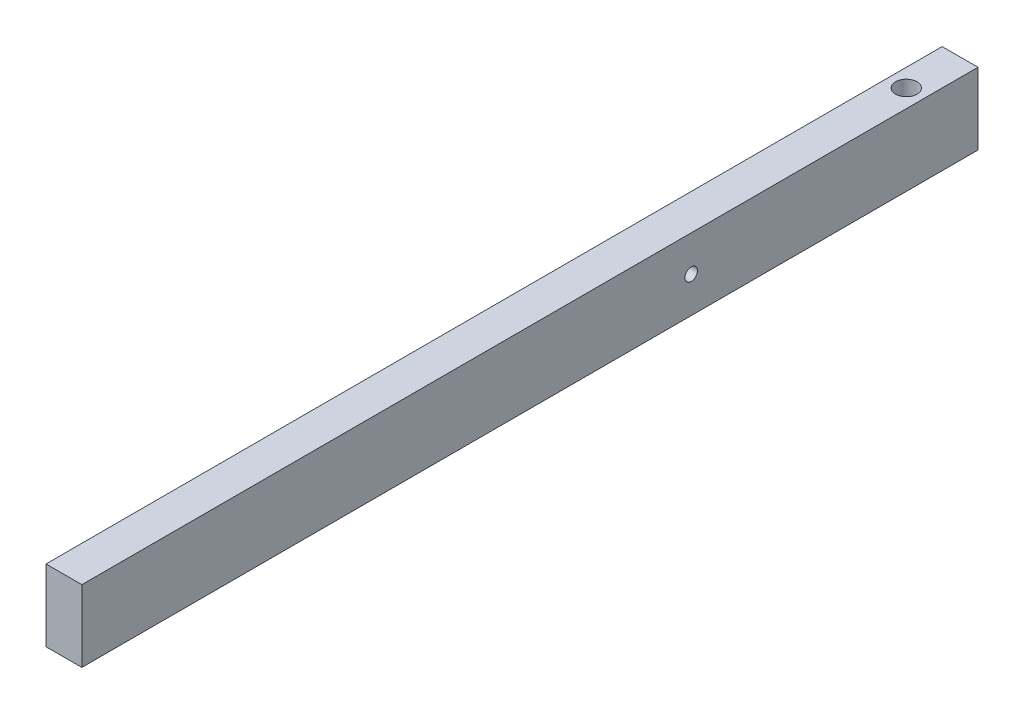
ISO-10303-21;
HEADER;
FILE_DESCRIPTION(('STEP AP214'),'2;1');
FILE_NAME('part.step','',(''),(''),'','','');
FILE_SCHEMA(('AUTOMOTIVE_DESIGN { 1 0 10303 214 1 1 1 1 }'));
ENDSEC;
DATA;
#1=APPLICATION_CONTEXT('core data for automotive mechanical design processes');
#2=APPLICATION_PROTOCOL_DEFINITION('international standard','automotive_design',2000,#1);
#3=PRODUCT_CONTEXT('',#1,'mechanical');
#4=PRODUCT('Part','Part','',(#3));
#5=PRODUCT_RELATED_PRODUCT_CATEGORY('part','',(#4));
#6=PRODUCT_DEFINITION_FORMATION('','',#4);
#7=PRODUCT_DEFINITION_CONTEXT('part definition',#1,'design');
#8=PRODUCT_DEFINITION('design','',#6,#7);
#9=PRODUCT_DEFINITION_SHAPE('','',#8);
#10=(LENGTH_UNIT() NAMED_UNIT(*) SI_UNIT(.MILLI.,.METRE.));
#11=(NAMED_UNIT(*) PLANE_ANGLE_UNIT() SI_UNIT($,.RADIAN.));
#12=(NAMED_UNIT(*) SI_UNIT($,.STERADIAN.) SOLID_ANGLE_UNIT());
#13=UNCERTAINTY_MEASURE_WITH_UNIT(LENGTH_MEASURE(1.E-05),#10,'distance_accuracy_value','');
#14=(GEOMETRIC_REPRESENTATION_CONTEXT(3) GLOBAL_UNCERTAINTY_ASSIGNED_CONTEXT((#13)) GLOBAL_UNIT_ASSIGNED_CONTEXT((#10,
#11,#12)) REPRESENTATION_CONTEXT('',''));
#15=CARTESIAN_POINT('',(0.,0.,0.));
#16=DIRECTION('',(0.,0.,1.));
#17=DIRECTION('',(1.,0.,0.));
#18=AXIS2_PLACEMENT_3D('',#15,#16,#17);
#19=CARTESIAN_POINT('',(10.,19.9999999999999,500.));
#20=DIRECTION('',(-1.,0.,0.));
#21=DIRECTION('',(0.,-1.,0.));
#22=AXIS2_PLACEMENT_3D('',#19,#20,#21);
#23=PLANE('',#22);
#24=CARTESIAN_POINT('',(10.,0.,160.));
#25=DIRECTION('',(-1.,0.,0.));
#26=DIRECTION('',(0.,-1.,0.));
#27=AXIS2_PLACEMENT_3D('',#24,#25,#26);
#28=CIRCLE('',#27,3.49999999999999);
#29=CARTESIAN_POINT('',(10.,-3.49999999999999,160.));
#30=VERTEX_POINT('',#29);
#31=EDGE_CURVE('E116',#30,#30,#28,.T.);
#32=ORIENTED_EDGE('',*,*,#31,.T.);
#33=EDGE_LOOP('',(#32));
#34=FACE_BOUND('',#33,.T.);
#35=DIRECTION('',(0.,1.,0.));
#36=VECTOR('',#35,1.);
#37=CARTESIAN_POINT('',(10.,19.9999999999999,0.));
#38=LINE('',#37,#36);
#39=CARTESIAN_POINT('',(10.,-20.0000000000001,0.));
#40=VERTEX_POINT('',#39);
#41=CARTESIAN_POINT('',(10.,19.9999999999999,0.));
#42=VERTEX_POINT('',#41);
#43=EDGE_CURVE('E99',#40,#42,#38,.T.);
#44=ORIENTED_EDGE('',*,*,#43,.T.);
#45=DIRECTION('',(0.,0.,-1.));
#46=VECTOR('',#45,1.);
#47=CARTESIAN_POINT('',(10.,19.9999999999999,500.));
#48=LINE('',#47,#46);
#49=CARTESIAN_POINT('',(10.,19.9999999999999,500.));
#50=VERTEX_POINT('',#49);
#51=EDGE_CURVE('E11',#50,#42,#48,.T.);
#52=ORIENTED_EDGE('',*,*,#51,.F.);
#53=DIRECTION('',(0.,1.,0.));
#54=VECTOR('',#53,1.);
#55=CARTESIAN_POINT('',(10.,19.9999999999999,500.));
#56=LINE('',#55,#54);
#57=CARTESIAN_POINT('',(10.,-20.0000000000001,500.));
#58=VERTEX_POINT('',#57);
#59=EDGE_CURVE('E87',#58,#50,#56,.T.);
#60=ORIENTED_EDGE('',*,*,#59,.F.);
#61=DIRECTION('',(0.,0.,-1.));
#62=VECTOR('',#61,1.);
#63=CARTESIAN_POINT('',(10.,-20.0000000000001,500.));
#64=LINE('',#63,#62);
#65=EDGE_CURVE('E95',#58,#40,#64,.T.);
#66=ORIENTED_EDGE('',*,*,#65,.T.);
#67=EDGE_LOOP('',(#44,#52,#60,#66));
#68=FACE_BOUND('',#67,.T.);
#69=ADVANCED_FACE('F36',(#34,#68),#23,.F.);
#70=CARTESIAN_POINT('',(-9.99999999999998,19.9999999999999,500.));
#71=DIRECTION('',(0.,-1.,0.));
#72=DIRECTION('',(0.,0.,-1.));
#73=AXIS2_PLACEMENT_3D('',#70,#71,#72);
#74=PLANE('',#73);
#75=CARTESIAN_POINT('',(0.,19.9999999999999,30.));
#76=DIRECTION('',(0.,1.,0.));
#77=DIRECTION('',(0.,0.,1.));
#78=AXIS2_PLACEMENT_3D('',#75,#76,#77);
#79=CIRCLE('',#78,6.);
#80=CARTESIAN_POINT('',(0.,19.9999999999999,36.));
#81=VERTEX_POINT('',#80);
#82=EDGE_CURVE('E113',#81,#81,#79,.T.);
#83=ORIENTED_EDGE('',*,*,#82,.F.);
#84=EDGE_LOOP('',(#83));
#85=FACE_BOUND('',#84,.T.);
#86=DIRECTION('',(-1.,0.,0.));
#87=VECTOR('',#86,1.);
#88=CARTESIAN_POINT('',(-9.99999999999998,19.9999999999999,0.));
#89=LINE('',#88,#87);
#90=CARTESIAN_POINT('',(-9.99999999999998,19.9999999999999,0.));
#91=VERTEX_POINT('',#90);
#92=EDGE_CURVE('E91',#42,#91,#89,.T.);
#93=ORIENTED_EDGE('',*,*,#92,.T.);
#94=DIRECTION('',(0.,0.,-1.));
#95=VECTOR('',#94,1.);
#96=CARTESIAN_POINT('',(-9.99999999999998,19.9999999999999,500.));
#97=LINE('',#96,#95);
#98=CARTESIAN_POINT('',(-9.99999999999998,19.9999999999999,500.));
#99=VERTEX_POINT('',#98);
#100=EDGE_CURVE('E44',#99,#91,#97,.T.);
#101=ORIENTED_EDGE('',*,*,#100,.F.);
#102=DIRECTION('',(-1.,0.,0.));
#103=VECTOR('',#102,1.);
#104=CARTESIAN_POINT('',(-9.99999999999998,19.9999999999999,500.));
#105=LINE('',#104,#103);
#106=EDGE_CURVE('E82',#50,#99,#105,.T.);
#107=ORIENTED_EDGE('',*,*,#106,.F.);
#108=ORIENTED_EDGE('',*,*,#51,.T.);
#109=EDGE_LOOP('',(#93,#101,#107,#108));
#110=FACE_BOUND('',#109,.T.);
#111=ADVANCED_FACE('F90',(#85,#110),#74,.F.);
#112=CARTESIAN_POINT('',(-9.99999999999998,19.9999999999999,500.));
#113=DIRECTION('',(1.,0.,0.));
#114=DIRECTION('',(0.,1.,0.));
#115=AXIS2_PLACEMENT_3D('',#112,#113,#114);
#116=PLANE('',#115);
#117=CARTESIAN_POINT('',(-9.99999999999998,0.,160.));
#118=DIRECTION('',(-1.,0.,0.));
#119=DIRECTION('',(0.,-1.,0.));
#120=AXIS2_PLACEMENT_3D('',#117,#118,#119);
#121=CIRCLE('',#120,3.49999999999999);
#122=CARTESIAN_POINT('',(-9.99999999999998,-3.49999999999999,160.));
#123=VERTEX_POINT('',#122);
#124=EDGE_CURVE('E119',#123,#123,#121,.T.);
#125=ORIENTED_EDGE('',*,*,#124,.F.);
#126=EDGE_LOOP('',(#125));
#127=FACE_BOUND('',#126,.T.);
#128=DIRECTION('',(0.,-1.,0.));
#129=VECTOR('',#128,1.);
#130=CARTESIAN_POINT('',(-9.99999999999998,19.9999999999999,0.));
#131=LINE('',#130,#129);
#132=CARTESIAN_POINT('',(-9.99999999999997,-20.0000000000001,0.));
#133=VERTEX_POINT('',#132);
#134=EDGE_CURVE('E69',#91,#133,#131,.T.);
#135=ORIENTED_EDGE('',*,*,#134,.T.);
#136=DIRECTION('',(0.,0.,-1.));
#137=VECTOR('',#136,1.);
#138=CARTESIAN_POINT('',(-9.99999999999997,-20.0000000000001,500.));
#139=LINE('',#138,#137);
#140=CARTESIAN_POINT('',(-9.99999999999997,-20.0000000000001,500.));
#141=VERTEX_POINT('',#140);
#142=EDGE_CURVE('E92',#141,#133,#139,.T.);
#143=ORIENTED_EDGE('',*,*,#142,.F.);
#144=DIRECTION('',(0.,-1.,0.));
#145=VECTOR('',#144,1.);
#146=CARTESIAN_POINT('',(-9.99999999999998,19.9999999999999,500.));
#147=LINE('',#146,#145);
#148=EDGE_CURVE('E85',#99,#141,#147,.T.);
#149=ORIENTED_EDGE('',*,*,#148,.F.);
#150=ORIENTED_EDGE('',*,*,#100,.T.);
#151=EDGE_LOOP('',(#135,#143,#149,#150));
#152=FACE_BOUND('',#151,.T.);
#153=ADVANCED_FACE('F93',(#127,#152),#116,.F.);
#154=CARTESIAN_POINT('',(-9.99999999999997,-20.0000000000001,500.));
#155=DIRECTION('',(0.,1.,0.));
#156=DIRECTION('',(0.,0.,1.));
#157=AXIS2_PLACEMENT_3D('',#154,#155,#156);
#158=PLANE('',#157);
#159=CARTESIAN_POINT('',(0.,-20.0000000000001,30.));
#160=DIRECTION('',(0.,1.,0.));
#161=DIRECTION('',(0.,0.,1.));
#162=AXIS2_PLACEMENT_3D('',#159,#160,#161);
#163=CIRCLE('',#162,6.);
#164=CARTESIAN_POINT('',(0.,-20.0000000000001,36.));
#165=VERTEX_POINT('',#164);
#166=EDGE_CURVE('E102',#165,#165,#163,.T.);
#167=ORIENTED_EDGE('',*,*,#166,.T.);
#168=EDGE_LOOP('',(#167));
#169=FACE_BOUND('',#168,.T.);
#170=DIRECTION('',(1.,0.,0.));
#171=VECTOR('',#170,1.);
#172=CARTESIAN_POINT('',(-9.99999999999997,-20.0000000000001,0.));
#173=LINE('',#172,#171);
#174=EDGE_CURVE('E75',#133,#40,#173,.T.);
#175=ORIENTED_EDGE('',*,*,#174,.T.);
#176=ORIENTED_EDGE('',*,*,#65,.F.);
#177=DIRECTION('',(1.,0.,0.));
#178=VECTOR('',#177,1.);
#179=CARTESIAN_POINT('',(-9.99999999999997,-20.0000000000001,500.));
#180=LINE('',#179,#178);
#181=EDGE_CURVE('E52',#141,#58,#180,.T.);
#182=ORIENTED_EDGE('',*,*,#181,.F.);
#183=ORIENTED_EDGE('',*,*,#142,.T.);
#184=EDGE_LOOP('',(#175,#176,#182,#183));
#185=FACE_BOUND('',#184,.T.);
#186=ADVANCED_FACE('F107',(#169,#185),#158,.F.);
#187=CARTESIAN_POINT('',(0.,0.,500.));
#188=DIRECTION('',(0.,0.,1.));
#189=DIRECTION('',(1.,0.,0.));
#190=AXIS2_PLACEMENT_3D('',#187,#188,#189);
#191=PLANE('',#190);
#192=ORIENTED_EDGE('',*,*,#59,.T.);
#193=ORIENTED_EDGE('',*,*,#106,.T.);
#194=ORIENTED_EDGE('',*,*,#148,.T.);
#195=ORIENTED_EDGE('',*,*,#181,.T.);
#196=EDGE_LOOP('',(#192,#193,#194,#195));
#197=FACE_BOUND('',#196,.T.);
#198=ADVANCED_FACE('F83',(#197),#191,.T.);
#199=CARTESIAN_POINT('',(0.,0.,0.));
#200=DIRECTION('',(0.,0.,1.));
#201=DIRECTION('',(1.,0.,0.));
#202=AXIS2_PLACEMENT_3D('',#199,#200,#201);
#203=PLANE('',#202);
#204=ORIENTED_EDGE('',*,*,#43,.F.);
#205=ORIENTED_EDGE('',*,*,#174,.F.);
#206=ORIENTED_EDGE('',*,*,#134,.F.);
#207=ORIENTED_EDGE('',*,*,#92,.F.);
#208=EDGE_LOOP('',(#204,#205,#206,#207));
#209=FACE_BOUND('',#208,.T.);
#210=ADVANCED_FACE('F110',(#209),#203,.F.);
#211=CARTESIAN_POINT('',(0.,-20.0000000000001,30.));
#212=DIRECTION('',(0.,1.,0.));
#213=DIRECTION('',(0.,0.,1.));
#214=AXIS2_PLACEMENT_3D('',#211,#212,#213);
#215=CYLINDRICAL_SURFACE('',#214,6.);
#216=ORIENTED_EDGE('',*,*,#166,.F.);
#217=EDGE_LOOP('',(#216));
#218=FACE_BOUND('',#217,.T.);
#219=ORIENTED_EDGE('',*,*,#82,.T.);
#220=EDGE_LOOP('',(#219));
#221=FACE_BOUND('',#220,.T.);
#222=ADVANCED_FACE('F129',(#218,#221),#215,.F.);
#223=CARTESIAN_POINT('',(10.,0.,160.));
#224=DIRECTION('',(-1.,0.,0.));
#225=DIRECTION('',(0.,-1.,0.));
#226=AXIS2_PLACEMENT_3D('',#223,#224,#225);
#227=CYLINDRICAL_SURFACE('',#226,3.49999999999999);
#228=CARTESIAN_POINT('',(10.,-3.49999999999999,160.));
#229=CARTESIAN_POINT('',(9.7916666666667,-3.49999999999999,160.));
#230=CARTESIAN_POINT('',(9.58333333333336,-3.49999999999999,160.));
#231=CARTESIAN_POINT('',(9.1666666666667,-3.49999999999999,160.));
#232=CARTESIAN_POINT('',(8.95833333333336,-3.49999999999999,160.));
#233=CARTESIAN_POINT('',(8.5416666666667,-3.49999999999999,160.));
#234=CARTESIAN_POINT('',(8.33333333333336,-3.49999999999999,160.));
#235=CARTESIAN_POINT('',(7.9166666666667,-3.49999999999999,160.));
#236=CARTESIAN_POINT('',(7.70833333333336,-3.49999999999999,160.));
#237=CARTESIAN_POINT('',(7.2916666666667,-3.49999999999999,160.));
#238=CARTESIAN_POINT('',(7.08333333333336,-3.49999999999999,160.));
#239=CARTESIAN_POINT('',(6.6666666666667,-3.49999999999999,160.));
#240=CARTESIAN_POINT('',(6.45833333333336,-3.49999999999999,160.));
#241=CARTESIAN_POINT('',(6.0416666666667,-3.49999999999999,160.));
#242=CARTESIAN_POINT('',(5.83333333333336,-3.49999999999999,160.));
#243=CARTESIAN_POINT('',(5.4166666666667,-3.49999999999999,160.));
#244=CARTESIAN_POINT('',(5.20833333333336,-3.49999999999999,160.));
#245=CARTESIAN_POINT('',(4.79166666666669,-3.49999999999999,160.));
#246=CARTESIAN_POINT('',(4.58333333333336,-3.49999999999999,160.));
#247=CARTESIAN_POINT('',(4.16666666666669,-3.49999999999999,160.));
#248=CARTESIAN_POINT('',(3.95833333333336,-3.49999999999999,160.));
#249=CARTESIAN_POINT('',(3.54166666666669,-3.49999999999999,160.));
#250=CARTESIAN_POINT('',(3.33333333333336,-3.49999999999999,160.));
#251=CARTESIAN_POINT('',(2.91666666666669,-3.49999999999999,160.));
#252=CARTESIAN_POINT('',(2.70833333333336,-3.49999999999999,160.));
#253=CARTESIAN_POINT('',(2.29166666666669,-3.49999999999999,160.));
#254=CARTESIAN_POINT('',(2.08333333333336,-3.49999999999999,160.));
#255=CARTESIAN_POINT('',(1.6666666666667,-3.49999999999999,160.));
#256=CARTESIAN_POINT('',(1.45833333333336,-3.49999999999999,160.));
#257=CARTESIAN_POINT('',(1.0416666666667,-3.49999999999999,160.));
#258=CARTESIAN_POINT('',(0.833333333333362,-3.49999999999999,160.));
#259=CARTESIAN_POINT('',(0.416666666666695,-3.49999999999999,160.));
#260=CARTESIAN_POINT('',(0.208333333333361,-3.49999999999999,160.));
#261=CARTESIAN_POINT('',(-0.208333333333306,-3.49999999999999,160.));
#262=CARTESIAN_POINT('',(-0.416666666666639,-3.49999999999999,160.));
#263=CARTESIAN_POINT('',(-0.833333333333306,-3.49999999999999,160.));
#264=CARTESIAN_POINT('',(-1.04166666666664,-3.49999999999999,160.));
#265=CARTESIAN_POINT('',(-1.45833333333331,-3.49999999999999,160.));
#266=CARTESIAN_POINT('',(-1.66666666666664,-3.49999999999999,160.));
#267=CARTESIAN_POINT('',(-2.08333333333331,-3.49999999999999,160.));
#268=CARTESIAN_POINT('',(-2.29166666666664,-3.49999999999999,160.));
#269=CARTESIAN_POINT('',(-2.70833333333331,-3.49999999999999,160.));
#270=CARTESIAN_POINT('',(-2.91666666666664,-3.49999999999999,160.));
#271=CARTESIAN_POINT('',(-3.33333333333331,-3.49999999999999,160.));
#272=CARTESIAN_POINT('',(-3.54166666666664,-3.49999999999999,160.));
#273=CARTESIAN_POINT('',(-3.95833333333331,-3.49999999999999,160.));
#274=CARTESIAN_POINT('',(-4.16666666666664,-3.49999999999999,160.));
#275=CARTESIAN_POINT('',(-4.58333333333331,-3.49999999999999,160.));
#276=CARTESIAN_POINT('',(-4.79166666666664,-3.49999999999999,160.));
#277=CARTESIAN_POINT('',(-5.20833333333331,-3.49999999999999,160.));
#278=CARTESIAN_POINT('',(-5.41666666666664,-3.49999999999999,160.));
#279=CARTESIAN_POINT('',(-5.83333333333331,-3.49999999999999,160.));
#280=CARTESIAN_POINT('',(-6.04166666666664,-3.49999999999999,160.));
#281=CARTESIAN_POINT('',(-6.45833333333331,-3.49999999999999,160.));
#282=CARTESIAN_POINT('',(-6.66666666666664,-3.49999999999999,160.));
#283=CARTESIAN_POINT('',(-7.08333333333331,-3.49999999999999,160.));
#284=CARTESIAN_POINT('',(-7.29166666666664,-3.49999999999999,160.));
#285=CARTESIAN_POINT('',(-7.70833333333331,-3.49999999999999,160.));
#286=CARTESIAN_POINT('',(-7.91666666666664,-3.49999999999999,160.));
#287=CARTESIAN_POINT('',(-8.33333333333331,-3.49999999999999,160.));
#288=CARTESIAN_POINT('',(-8.54166666666664,-3.49999999999999,160.));
#289=CARTESIAN_POINT('',(-8.95833333333331,-3.49999999999999,160.));
#290=CARTESIAN_POINT('',(-9.16666666666664,-3.49999999999999,160.));
#291=CARTESIAN_POINT('',(-9.58333333333331,-3.49999999999999,160.));
#292=CARTESIAN_POINT('',(-9.79166666666664,-3.49999999999999,160.));
#293=CARTESIAN_POINT('',(-9.99999999999998,-3.49999999999999,160.));
#294=B_SPLINE_CURVE_WITH_KNOTS('',3,(#228,#229,#230,#231,#232,#233,#234,#235,#236,#237,#238,
#239,#240,#241,#242,#243,#244,#245,#246,#247,#248,#249,#250,#251,#252,#253,#254,#255,#256,#257,
#258,#259,#260,#261,#262,#263,#264,#265,#266,#267,#268,#269,#270,#271,#272,#273,#274,#275,#276,
#277,#278,#279,#280,#281,#282,#283,#284,#285,#286,#287,#288,#289,#290,#291,#292,#293),
.UNSPECIFIED.,.F.,.F.,(4,2,2,2,2,2,2,2,2,2,2,2,2,2,2,2,2,2,2,2,2,2,2,2,2,2,2,2,2,2,2,2,4),(0.,
0.625000000000001,1.25,1.875,2.5,3.125,3.75,4.375,5.,5.625,6.25,6.875,7.5,8.125,8.75,9.375,10.,
10.625,11.25,11.875,12.5,13.125,13.75,14.375,15.,15.625,16.25,16.875,17.5,18.125,18.75,19.375,
20.),.UNSPECIFIED.);
#295=EDGE_CURVE('BSEAM126',#30,#123,#294,.T.);
#296=ORIENTED_EDGE('',*,*,#31,.F.);
#297=ORIENTED_EDGE('',*,*,#124,.T.);
#298=ORIENTED_EDGE('',*,*,#295,.T.);
#299=ORIENTED_EDGE('',*,*,#295,.F.);
#300=EDGE_LOOP('',(#296,#298,#297,#299));
#301=FACE_BOUND('',#300,.T.);
#302=ADVANCED_FACE('F126',(#301),#227,.F.);
#303=CLOSED_SHELL('',(#69,#111,#153,#186,#198,#210,#222,#302));
#304=MANIFOLD_SOLID_BREP('B2',#303);
#305=ADVANCED_BREP_SHAPE_REPRESENTATION('',(#18,#304),#14);
#306=SHAPE_DEFINITION_REPRESENTATION(#9,#305);
ENDSEC;
END-ISO-10303-21;
